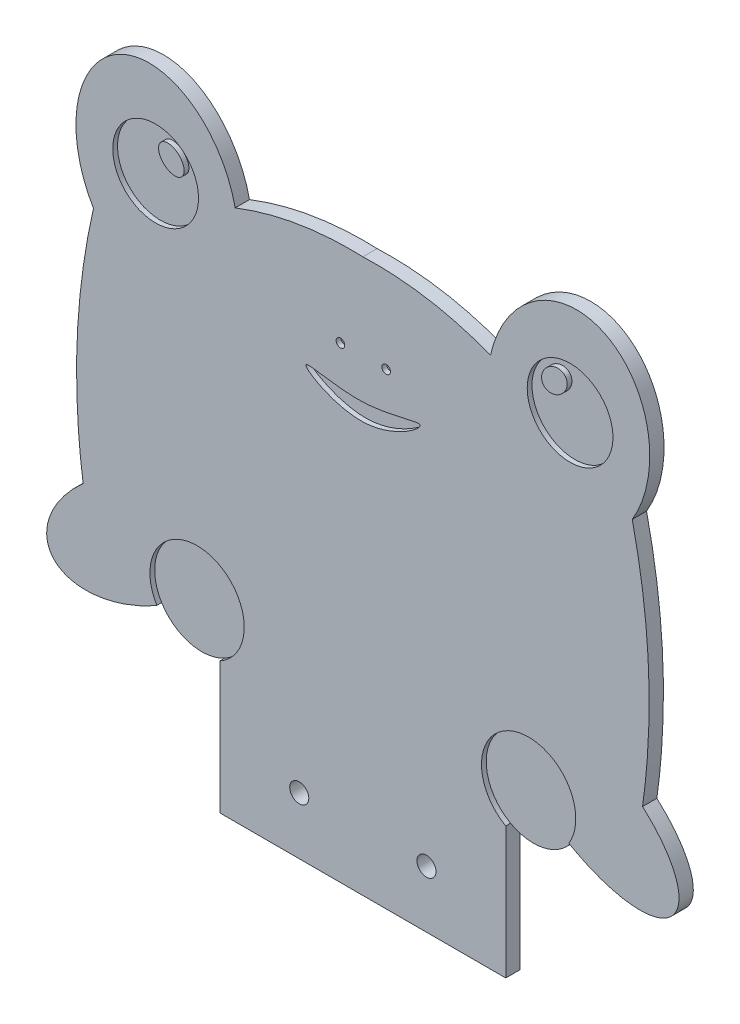
ISO-10303-21;
HEADER;
FILE_DESCRIPTION(('STEP AP214'),'2;1');
FILE_NAME('part.step','',(''),(''),'','','');
FILE_SCHEMA(('AUTOMOTIVE_DESIGN { 1 0 10303 214 1 1 1 1 }'));
ENDSEC;
DATA;
#1=APPLICATION_CONTEXT('core data for automotive mechanical design processes');
#2=APPLICATION_PROTOCOL_DEFINITION('international standard','automotive_design',2000,#1);
#3=PRODUCT_CONTEXT('',#1,'mechanical');
#4=PRODUCT('Part','Part','',(#3));
#5=PRODUCT_RELATED_PRODUCT_CATEGORY('part','',(#4));
#6=PRODUCT_DEFINITION_FORMATION('','',#4);
#7=PRODUCT_DEFINITION_CONTEXT('part definition',#1,'design');
#8=PRODUCT_DEFINITION('design','',#6,#7);
#9=PRODUCT_DEFINITION_SHAPE('','',#8);
#10=(LENGTH_UNIT() NAMED_UNIT(*) SI_UNIT(.MILLI.,.METRE.));
#11=(NAMED_UNIT(*) PLANE_ANGLE_UNIT() SI_UNIT($,.RADIAN.));
#12=(NAMED_UNIT(*) SI_UNIT($,.STERADIAN.) SOLID_ANGLE_UNIT());
#13=UNCERTAINTY_MEASURE_WITH_UNIT(LENGTH_MEASURE(1.E-05),#10,'distance_accuracy_value','');
#14=(GEOMETRIC_REPRESENTATION_CONTEXT(3) GLOBAL_UNCERTAINTY_ASSIGNED_CONTEXT((#13)) GLOBAL_UNIT_ASSIGNED_CONTEXT((#10,
#11,#12)) REPRESENTATION_CONTEXT('',''));
#15=CARTESIAN_POINT('',(0.,0.,0.));
#16=DIRECTION('',(0.,0.,1.));
#17=DIRECTION('',(1.,0.,0.));
#18=AXIS2_PLACEMENT_3D('',#15,#16,#17);
#19=CARTESIAN_POINT('',(-34.8,-34.2,3.));
#20=DIRECTION('',(0.,0.,-1.));
#21=DIRECTION('',(-1.,0.,0.));
#22=AXIS2_PLACEMENT_3D('',#19,#20,#21);
#23=CYLINDRICAL_SURFACE('',#22,9.9);
#24=CARTESIAN_POINT('',(-34.8,-34.2,2.));
#25=DIRECTION('',(0.,0.,1.));
#26=DIRECTION('',(1.,0.,0.));
#27=AXIS2_PLACEMENT_3D('',#24,#25,#26);
#28=CIRCLE('',#27,9.9);
#29=CARTESIAN_POINT('',(-43.2356609466188,-39.3816623195351,2.));
#30=VERTEX_POINT('',#29);
#31=CARTESIAN_POINT('',(-30.,-42.8585218137971,2.));
#32=VERTEX_POINT('',#31);
#33=EDGE_CURVE('E675',#30,#32,#28,.T.);
#34=ORIENTED_EDGE('',*,*,#33,.F.);
#35=DIRECTION('',(0.,0.,-1.));
#36=VECTOR('',#35,1.);
#37=CARTESIAN_POINT('',(-43.2356609466188,-39.3816623195351,3.));
#38=LINE('',#37,#36);
#39=CARTESIAN_POINT('',(-43.2356609466188,-39.3816623195351,0.));
#40=VERTEX_POINT('',#39);
#41=EDGE_CURVE('E621',#30,#40,#38,.T.);
#42=ORIENTED_EDGE('',*,*,#41,.T.);
#43=CARTESIAN_POINT('',(-34.8,-34.2,0.));
#44=DIRECTION('',(0.,0.,1.));
#45=DIRECTION('',(1.,0.,0.));
#46=AXIS2_PLACEMENT_3D('',#43,#44,#45);
#47=CIRCLE('',#46,9.9);
#48=CARTESIAN_POINT('',(-30.,-42.8585218137971,0.));
#49=VERTEX_POINT('',#48);
#50=EDGE_CURVE('E632',#40,#49,#47,.T.);
#51=ORIENTED_EDGE('',*,*,#50,.T.);
#52=DIRECTION('',(0.,0.,-1.));
#53=VECTOR('',#52,1.);
#54=CARTESIAN_POINT('',(-30.,-42.8585218137971,3.));
#55=LINE('',#54,#53);
#56=EDGE_CURVE('E635',#32,#49,#55,.T.);
#57=ORIENTED_EDGE('',*,*,#56,.F.);
#58=EDGE_LOOP('',(#34,#42,#51,#57));
#59=FACE_BOUND('',#58,.T.);
#60=ADVANCED_FACE('F416',(#59),#23,.T.);
#61=CARTESIAN_POINT('',(0.,0.,3.));
#62=DIRECTION('',(0.,0.,1.));
#63=DIRECTION('',(1.,0.,0.));
#64=AXIS2_PLACEMENT_3D('',#61,#62,#63);
#65=PLANE('',#64);
#66=CARTESIAN_POINT('',(-13.35,-58.5,3.));
#67=DIRECTION('',(0.,0.,1.));
#68=DIRECTION('',(1.,0.,0.));
#69=AXIS2_PLACEMENT_3D('',#66,#67,#68);
#70=CIRCLE('',#69,2.);
#71=CARTESIAN_POINT('',(-11.35,-58.5,3.));
#72=VERTEX_POINT('',#71);
#73=EDGE_CURVE('E861',#72,#72,#70,.T.);
#74=ORIENTED_EDGE('',*,*,#73,.F.);
#75=EDGE_LOOP('',(#74));
#76=FACE_BOUND('',#75,.T.);
#77=CARTESIAN_POINT('',(13.35,-58.5,3.));
#78=DIRECTION('',(0.,0.,1.));
#79=DIRECTION('',(1.,0.,0.));
#80=AXIS2_PLACEMENT_3D('',#77,#78,#79);
#81=CIRCLE('',#80,2.);
#82=CARTESIAN_POINT('',(15.35,-58.5,3.));
#83=VERTEX_POINT('',#82);
#84=EDGE_CURVE('E856',#83,#83,#81,.T.);
#85=ORIENTED_EDGE('',*,*,#84,.F.);
#86=EDGE_LOOP('',(#85));
#87=FACE_BOUND('',#86,.T.);
#88=CARTESIAN_POINT('',(-34.8,-34.2,3.));
#89=DIRECTION('',(0.,0.,1.));
#90=DIRECTION('',(1.,0.,0.));
#91=AXIS2_PLACEMENT_3D('',#88,#89,#90);
#92=CIRCLE('',#91,9.9);
#93=CARTESIAN_POINT('',(-30.,-42.8585218137971,3.));
#94=VERTEX_POINT('',#93);
#95=CARTESIAN_POINT('',(-43.2356609466188,-39.3816623195351,3.));
#96=VERTEX_POINT('',#95);
#97=EDGE_CURVE('E849',#94,#96,#92,.T.);
#98=ORIENTED_EDGE('',*,*,#97,.F.);
#99=DIRECTION('',(0.,-1.,0.));
#100=VECTOR('',#99,1.);
#101=CARTESIAN_POINT('',(-30.,-10.5,3.));
#102=LINE('',#101,#100);
#103=CARTESIAN_POINT('',(-30.,-70.5,3.));
#104=VERTEX_POINT('',#103);
#105=EDGE_CURVE('E647',#94,#104,#102,.T.);
#106=ORIENTED_EDGE('',*,*,#105,.T.);
#107=DIRECTION('',(1.,0.,0.));
#108=VECTOR('',#107,1.);
#109=CARTESIAN_POINT('',(-30.,-70.5,3.));
#110=LINE('',#109,#108);
#111=CARTESIAN_POINT('',(30.,-70.5,3.));
#112=VERTEX_POINT('',#111);
#113=EDGE_CURVE('E641',#104,#112,#110,.T.);
#114=ORIENTED_EDGE('',*,*,#113,.T.);
#115=DIRECTION('',(0.,-1.,0.));
#116=VECTOR('',#115,1.);
#117=CARTESIAN_POINT('',(30.,-10.5,3.));
#118=LINE('',#117,#116);
#119=CARTESIAN_POINT('',(30.,-42.8585218137971,3.));
#120=VERTEX_POINT('',#119);
#121=EDGE_CURVE('E644',#120,#112,#118,.T.);
#122=ORIENTED_EDGE('',*,*,#121,.F.);
#123=CARTESIAN_POINT('',(34.8,-34.2,3.));
#124=DIRECTION('',(0.,0.,1.));
#125=DIRECTION('',(-1.,0.,0.));
#126=AXIS2_PLACEMENT_3D('',#123,#124,#125);
#127=CIRCLE('',#126,9.9);
#128=CARTESIAN_POINT('',(43.2356609466188,-39.3816623195351,3.));
#129=VERTEX_POINT('',#128);
#130=EDGE_CURVE('E685',#129,#120,#127,.T.);
#131=ORIENTED_EDGE('',*,*,#130,.F.);
#132=CARTESIAN_POINT('',(47.712,-29.82,3.));
#133=DIRECTION('',(0.,0.,-1.));
#134=DIRECTION('',(0.847998304005088,-0.52999894000318,0.));
#135=AXIS2_PLACEMENT_3D('',#132,#133,#134);
#136=ELLIPSE('',#135,21.,10.5);
#137=CARTESIAN_POINT('',(58.715402700733,-24.9746712271509,3.));
#138=VERTEX_POINT('',#137);
#139=EDGE_CURVE('E626',#138,#129,#136,.T.);
#140=ORIENTED_EDGE('',*,*,#139,.F.);
#141=CARTESIAN_POINT('',(56.5490471536024,26.1535692010801,3.));
#142=CARTESIAN_POINT('',(63.7245288982319,-5.54456864556982,3.));
#143=CARTESIAN_POINT('',(56.4,-37.5,3.));
#144=B_SPLINE_CURVE_WITH_KNOTS('',2,(#141,#142,#143),.UNSPECIFIED.,.F.,.F.,(3,3),(0.,1.),.UNSPECIFIED.);
#145=CARTESIAN_POINT('',(56.5490471536024,26.1535692010801,3.));
#146=VERTEX_POINT('',#145);
#147=EDGE_CURVE('E596',#146,#138,#144,.T.);
#148=ORIENTED_EDGE('',*,*,#147,.F.);
#149=CARTESIAN_POINT('',(43.2,37.5,3.));
#150=DIRECTION('',(0.,0.,-1.));
#151=DIRECTION('',(0.214939209404732,0.976627429606843,0.));
#152=AXIS2_PLACEMENT_3D('',#149,#150,#151);
#153=ELLIPSE('',#152,21.1032368897287,16.8);
#154=CARTESIAN_POINT('',(26.792659182605,41.1109787179995,3.));
#155=VERTEX_POINT('',#154);
#156=EDGE_CURVE('E589',#155,#146,#153,.T.);
#157=ORIENTED_EDGE('',*,*,#156,.F.);
#158=CARTESIAN_POINT('',(26.792659182605,41.1109787179995,3.));
#159=CARTESIAN_POINT('',(13.8894718421748,46.1319547629389,3.));
#160=CARTESIAN_POINT('',(0.,45.6,3.));
#161=B_SPLINE_CURVE_WITH_KNOTS('',2,(#158,#159,#160),.UNSPECIFIED.,.F.,.F.,(3,3),(0.,1.),.UNSPECIFIED.);
#162=CARTESIAN_POINT('',(0.,45.6,3.));
#163=VERTEX_POINT('',#162);
#164=EDGE_CURVE('E581',#155,#163,#161,.T.);
#165=ORIENTED_EDGE('',*,*,#164,.T.);
#166=CARTESIAN_POINT('',(-26.792659182605,41.1109787179995,3.));
#167=CARTESIAN_POINT('',(-13.8894718421748,46.1319547629389,3.));
#168=CARTESIAN_POINT('',(0.,45.6,3.));
#169=B_SPLINE_CURVE_WITH_KNOTS('',2,(#166,#167,#168),.UNSPECIFIED.,.F.,.F.,(3,3),(0.,1.),.UNSPECIFIED.);
#170=CARTESIAN_POINT('',(-26.792659182605,41.1109787179995,3.));
#171=VERTEX_POINT('',#170);
#172=EDGE_CURVE('E531',#171,#163,#169,.T.);
#173=ORIENTED_EDGE('',*,*,#172,.F.);
#174=CARTESIAN_POINT('',(-43.2,37.5,3.));
#175=DIRECTION('',(0.,0.,1.));
#176=DIRECTION('',(-0.214939209404733,0.976627429606843,0.));
#177=AXIS2_PLACEMENT_3D('',#174,#175,#176);
#178=ELLIPSE('',#177,21.1032368897287,16.8);
#179=CARTESIAN_POINT('',(-56.5490471536024,26.1535692010801,3.));
#180=VERTEX_POINT('',#179);
#181=EDGE_CURVE('E522',#171,#180,#178,.T.);
#182=ORIENTED_EDGE('',*,*,#181,.T.);
#183=CARTESIAN_POINT('',(-56.5490471536024,26.1535692010801,3.));
#184=CARTESIAN_POINT('',(-63.7245288982319,-5.54456864556982,3.));
#185=CARTESIAN_POINT('',(-56.4,-37.5,3.));
#186=B_SPLINE_CURVE_WITH_KNOTS('',2,(#183,#184,#185),.UNSPECIFIED.,.F.,.F.,(3,3),(0.,1.),.UNSPECIFIED.);
#187=CARTESIAN_POINT('',(-58.715402700733,-24.9746712271509,3.));
#188=VERTEX_POINT('',#187);
#189=EDGE_CURVE('E529',#180,#188,#186,.T.);
#190=ORIENTED_EDGE('',*,*,#189,.T.);
#191=CARTESIAN_POINT('',(-47.712,-29.82,3.));
#192=DIRECTION('',(0.,0.,1.));
#193=DIRECTION('',(-0.847998304005088,-0.52999894000318,0.));
#194=AXIS2_PLACEMENT_3D('',#191,#192,#193);
#195=ELLIPSE('',#194,21.,10.5);
#196=EDGE_CURVE('E618',#188,#96,#195,.T.);
#197=ORIENTED_EDGE('',*,*,#196,.T.);
#198=EDGE_LOOP('',(#98,#106,#114,#122,#131,#140,#148,#157,#165,#173,#182,#190,#197));
#199=FACE_BOUND('',#198,.T.);
#200=CARTESIAN_POINT('',(-11.9791691585053,20.,3.));
#201=CARTESIAN_POINT('',(-12.2218538112106,19.1634506144739,3.));
#202=CARTESIAN_POINT('',(0.336817720777928,11.5253867947841,3.));
#203=CARTESIAN_POINT('',(17.9163741988928,24.2247446951573,3.));
#204=CARTESIAN_POINT('',(0.167482990841705,17.1340066363648,3.));
#205=CARTESIAN_POINT('',(-11.7502543081893,20.789084003603,3.));
#206=CARTESIAN_POINT('',(-11.9791691585053,20.,3.));
#207=B_SPLINE_CURVE_WITH_KNOTS('',3,(#200,#201,#202,#203,#204,#205,#206),.UNSPECIFIED.,.T.,.F.,
(4,1,1,1,4),(0.,0.256649661559157,0.517799284457874,0.757912508250658,1.),.UNSPECIFIED.);
#208=CARTESIAN_POINT('',(-11.9791691585053,20.,3.));
#209=VERTEX_POINT('',#208);
#210=EDGE_CURVE('E694',#209,#209,#207,.T.);
#211=ORIENTED_EDGE('',*,*,#210,.F.);
#212=EDGE_LOOP('',(#211));
#213=FACE_BOUND('',#212,.T.);
#214=CARTESIAN_POINT('',(4.89293127120258,27.5997231955837,3.));
#215=DIRECTION('',(0.,0.,1.));
#216=DIRECTION('',(1.,0.,0.));
#217=AXIS2_PLACEMENT_3D('',#214,#215,#216);
#218=CIRCLE('',#217,0.899999999999996);
#219=CARTESIAN_POINT('',(5.79293127120257,27.5997231955837,3.));
#220=VERTEX_POINT('',#219);
#221=EDGE_CURVE('E1088',#220,#220,#218,.T.);
#222=ORIENTED_EDGE('',*,*,#221,.F.);
#223=EDGE_LOOP('',(#222));
#224=FACE_BOUND('',#223,.T.);
#225=CARTESIAN_POINT('',(-4.70706872879742,27.5997231955837,3.));
#226=DIRECTION('',(0.,0.,1.));
#227=DIRECTION('',(1.,0.,0.));
#228=AXIS2_PLACEMENT_3D('',#225,#226,#227);
#229=CIRCLE('',#228,0.899999999999995);
#230=CARTESIAN_POINT('',(-3.80706872879743,27.5997231955837,3.));
#231=VERTEX_POINT('',#230);
#232=EDGE_CURVE('E674',#231,#231,#229,.T.);
#233=ORIENTED_EDGE('',*,*,#232,.F.);
#234=EDGE_LOOP('',(#233));
#235=FACE_BOUND('',#234,.T.);
#236=CARTESIAN_POINT('',(43.5,39.,3.));
#237=DIRECTION('',(0.,0.,-1.));
#238=DIRECTION('',(-1.,0.,0.));
#239=AXIS2_PLACEMENT_3D('',#236,#237,#238);
#240=CIRCLE('',#239,9.);
#241=CARTESIAN_POINT('',(34.5,39.,3.));
#242=VERTEX_POINT('',#241);
#243=EDGE_CURVE('E748',#242,#242,#240,.T.);
#244=ORIENTED_EDGE('',*,*,#243,.T.);
#245=EDGE_LOOP('',(#244));
#246=FACE_BOUND('',#245,.T.);
#247=CARTESIAN_POINT('',(-43.5,39.,3.));
#248=DIRECTION('',(0.,0.,1.));
#249=DIRECTION('',(1.,0.,0.));
#250=AXIS2_PLACEMENT_3D('',#247,#248,#249);
#251=CIRCLE('',#250,9.);
#252=CARTESIAN_POINT('',(-34.5,39.,3.));
#253=VERTEX_POINT('',#252);
#254=EDGE_CURVE('E738',#253,#253,#251,.T.);
#255=ORIENTED_EDGE('',*,*,#254,.F.);
#256=EDGE_LOOP('',(#255));
#257=FACE_BOUND('',#256,.T.);
#258=ADVANCED_FACE('F525',(#76,#87,#199,#213,#224,#235,#246,#257),#65,.T.);
#259=DIRECTION('',(0.,0.,-1.));
#260=VECTOR('',#259,1.);
#261=SURFACE_OF_LINEAR_EXTRUSION('',#153,#260);
#262=CARTESIAN_POINT('',(43.2,37.5,0.));
#263=DIRECTION('',(0.,0.,-1.));
#264=DIRECTION('',(0.214939209404732,0.976627429606843,0.));
#265=AXIS2_PLACEMENT_3D('',#262,#263,#264);
#266=ELLIPSE('',#265,21.1032368897287,16.8);
#267=CARTESIAN_POINT('',(26.792659182605,41.1109787179995,0.));
#268=VERTEX_POINT('',#267);
#269=CARTESIAN_POINT('',(56.5490471536024,26.1535692010801,0.));
#270=VERTEX_POINT('',#269);
#271=EDGE_CURVE('E830',#268,#270,#266,.T.);
#272=ORIENTED_EDGE('',*,*,#271,.F.);
#273=DIRECTION('',(0.,0.,-1.));
#274=VECTOR('',#273,1.);
#275=CARTESIAN_POINT('',(26.792659182605,41.1109787179995,3.));
#276=LINE('',#275,#274);
#277=EDGE_CURVE('E426',#155,#268,#276,.T.);
#278=ORIENTED_EDGE('',*,*,#277,.F.);
#279=ORIENTED_EDGE('',*,*,#156,.T.);
#280=DIRECTION('',(0.,0.,-1.));
#281=VECTOR('',#280,1.);
#282=CARTESIAN_POINT('',(56.5490471536024,26.1535692010801,3.));
#283=LINE('',#282,#281);
#284=EDGE_CURVE('E12',#146,#270,#283,.T.);
#285=ORIENTED_EDGE('',*,*,#284,.T.);
#286=EDGE_LOOP('',(#272,#278,#279,#285));
#287=FACE_BOUND('',#286,.T.);
#288=ADVANCED_FACE('F601',(#287),#261,.T.);
#289=DIRECTION('',(0.,0.,-1.));
#290=VECTOR('',#289,1.);
#291=SURFACE_OF_LINEAR_EXTRUSION('',#161,#290);
#292=CARTESIAN_POINT('',(26.792659182605,41.1109787179995,0.));
#293=CARTESIAN_POINT('',(13.8894718421748,46.1319547629389,0.));
#294=CARTESIAN_POINT('',(0.,45.6,0.));
#295=B_SPLINE_CURVE_WITH_KNOTS('',2,(#292,#293,#294),.UNSPECIFIED.,.F.,.F.,(3,3),(0.,1.),.UNSPECIFIED.);
#296=CARTESIAN_POINT('',(0.,45.6,0.));
#297=VERTEX_POINT('',#296);
#298=EDGE_CURVE('E825',#268,#297,#295,.T.);
#299=ORIENTED_EDGE('',*,*,#298,.T.);
#300=DIRECTION('',(0.,0.,-1.));
#301=VECTOR('',#300,1.);
#302=CARTESIAN_POINT('',(0.,45.6,3.));
#303=LINE('',#302,#301);
#304=EDGE_CURVE('E819',#163,#297,#303,.T.);
#305=ORIENTED_EDGE('',*,*,#304,.F.);
#306=ORIENTED_EDGE('',*,*,#164,.F.);
#307=ORIENTED_EDGE('',*,*,#277,.T.);
#308=EDGE_LOOP('',(#299,#305,#306,#307));
#309=FACE_BOUND('',#308,.T.);
#310=ADVANCED_FACE('F574',(#309),#291,.F.);
#311=DIRECTION('',(0.,0.,-1.));
#312=VECTOR('',#311,1.);
#313=SURFACE_OF_LINEAR_EXTRUSION('',#169,#312);
#314=CARTESIAN_POINT('',(-26.792659182605,41.1109787179995,0.));
#315=CARTESIAN_POINT('',(-13.8894718421748,46.1319547629389,0.));
#316=CARTESIAN_POINT('',(0.,45.6,0.));
#317=B_SPLINE_CURVE_WITH_KNOTS('',2,(#314,#315,#316),.UNSPECIFIED.,.F.,.F.,(3,3),(0.,1.),.UNSPECIFIED.);
#318=CARTESIAN_POINT('',(-26.792659182605,41.1109787179995,0.));
#319=VERTEX_POINT('',#318);
#320=EDGE_CURVE('E808',#319,#297,#317,.T.);
#321=ORIENTED_EDGE('',*,*,#320,.F.);
#322=DIRECTION('',(0.,0.,-1.));
#323=VECTOR('',#322,1.);
#324=CARTESIAN_POINT('',(-26.792659182605,41.1109787179995,3.));
#325=LINE('',#324,#323);
#326=EDGE_CURVE('E542',#171,#319,#325,.T.);
#327=ORIENTED_EDGE('',*,*,#326,.F.);
#328=ORIENTED_EDGE('',*,*,#172,.T.);
#329=ORIENTED_EDGE('',*,*,#304,.T.);
#330=EDGE_LOOP('',(#321,#327,#328,#329));
#331=FACE_BOUND('',#330,.T.);
#332=ADVANCED_FACE('F571',(#331),#313,.T.);
#333=DIRECTION('',(0.,0.,-1.));
#334=VECTOR('',#333,1.);
#335=SURFACE_OF_LINEAR_EXTRUSION('',#178,#334);
#336=CARTESIAN_POINT('',(-43.2,37.5,0.));
#337=DIRECTION('',(0.,0.,1.));
#338=DIRECTION('',(-0.214939209404733,0.976627429606843,0.));
#339=AXIS2_PLACEMENT_3D('',#336,#337,#338);
#340=ELLIPSE('',#339,21.1032368897287,16.8);
#341=CARTESIAN_POINT('',(-56.5490471536024,26.1535692010801,0.));
#342=VERTEX_POINT('',#341);
#343=EDGE_CURVE('E538',#319,#342,#340,.T.);
#344=ORIENTED_EDGE('',*,*,#343,.T.);
#345=DIRECTION('',(0.,0.,-1.));
#346=VECTOR('',#345,1.);
#347=CARTESIAN_POINT('',(-56.5490471536024,26.1535692010801,3.));
#348=LINE('',#347,#346);
#349=EDGE_CURVE('E535',#180,#342,#348,.T.);
#350=ORIENTED_EDGE('',*,*,#349,.F.);
#351=ORIENTED_EDGE('',*,*,#181,.F.);
#352=ORIENTED_EDGE('',*,*,#326,.T.);
#353=EDGE_LOOP('',(#344,#350,#351,#352));
#354=FACE_BOUND('',#353,.T.);
#355=ADVANCED_FACE('F536',(#354),#335,.F.);
#356=DIRECTION('',(0.,0.,-1.));
#357=VECTOR('',#356,1.);
#358=SURFACE_OF_LINEAR_EXTRUSION('',#186,#357);
#359=CARTESIAN_POINT('',(-56.5490471536024,26.1535692010801,0.));
#360=CARTESIAN_POINT('',(-63.7245288982319,-5.54456864556982,0.));
#361=CARTESIAN_POINT('',(-56.4,-37.5,0.));
#362=B_SPLINE_CURVE_WITH_KNOTS('',2,(#359,#360,#361),.UNSPECIFIED.,.F.,.F.,(3,3),(0.,1.),.UNSPECIFIED.);
#363=CARTESIAN_POINT('',(-58.715402700733,-24.9746712271509,0.));
#364=VERTEX_POINT('',#363);
#365=EDGE_CURVE('E805',#342,#364,#362,.T.);
#366=ORIENTED_EDGE('',*,*,#365,.T.);
#367=DIRECTION('',(0.,0.,-1.));
#368=VECTOR('',#367,1.);
#369=CARTESIAN_POINT('',(-58.715402700733,-24.9746712271509,3.));
#370=LINE('',#369,#368);
#371=EDGE_CURVE('E543',#188,#364,#370,.T.);
#372=ORIENTED_EDGE('',*,*,#371,.F.);
#373=ORIENTED_EDGE('',*,*,#189,.F.);
#374=ORIENTED_EDGE('',*,*,#349,.T.);
#375=EDGE_LOOP('',(#366,#372,#373,#374));
#376=FACE_BOUND('',#375,.T.);
#377=ADVANCED_FACE('F545',(#376),#358,.F.);
#378=DIRECTION('',(0.,0.,-1.));
#379=VECTOR('',#378,1.);
#380=SURFACE_OF_LINEAR_EXTRUSION('',#144,#379);
#381=CARTESIAN_POINT('',(56.5490471536024,26.1535692010801,0.));
#382=CARTESIAN_POINT('',(63.7245288982319,-5.54456864556982,0.));
#383=CARTESIAN_POINT('',(56.4,-37.5,0.));
#384=B_SPLINE_CURVE_WITH_KNOTS('',2,(#381,#382,#383),.UNSPECIFIED.,.F.,.F.,(3,3),(0.,1.),.UNSPECIFIED.);
#385=CARTESIAN_POINT('',(58.715402700733,-24.9746712271509,0.));
#386=VERTEX_POINT('',#385);
#387=EDGE_CURVE('E555',#270,#386,#384,.T.);
#388=ORIENTED_EDGE('',*,*,#387,.F.);
#389=ORIENTED_EDGE('',*,*,#284,.F.);
#390=ORIENTED_EDGE('',*,*,#147,.T.);
#391=DIRECTION('',(0.,0.,-1.));
#392=VECTOR('',#391,1.);
#393=CARTESIAN_POINT('',(58.715402700733,-24.9746712271509,3.));
#394=LINE('',#393,#392);
#395=EDGE_CURVE('E435',#138,#386,#394,.T.);
#396=ORIENTED_EDGE('',*,*,#395,.T.);
#397=EDGE_LOOP('',(#388,#389,#390,#396));
#398=FACE_BOUND('',#397,.T.);
#399=ADVANCED_FACE('F566',(#398),#380,.T.);
#400=CARTESIAN_POINT('',(0.,0.,0.));
#401=DIRECTION('',(0.,0.,1.));
#402=DIRECTION('',(1.,0.,0.));
#403=AXIS2_PLACEMENT_3D('',#400,#401,#402);
#404=PLANE('',#403);
#405=CARTESIAN_POINT('',(-13.35,-58.5,0.));
#406=DIRECTION('',(0.,0.,1.));
#407=DIRECTION('',(1.,0.,0.));
#408=AXIS2_PLACEMENT_3D('',#405,#406,#407);
#409=CIRCLE('',#408,2.);
#410=CARTESIAN_POINT('',(-11.35,-58.5,0.));
#411=VERTEX_POINT('',#410);
#412=EDGE_CURVE('E859',#411,#411,#409,.T.);
#413=ORIENTED_EDGE('',*,*,#412,.T.);
#414=EDGE_LOOP('',(#413));
#415=FACE_BOUND('',#414,.T.);
#416=CARTESIAN_POINT('',(13.35,-58.5,0.));
#417=DIRECTION('',(0.,0.,1.));
#418=DIRECTION('',(1.,0.,0.));
#419=AXIS2_PLACEMENT_3D('',#416,#417,#418);
#420=CIRCLE('',#419,2.);
#421=CARTESIAN_POINT('',(15.35,-58.5,0.));
#422=VERTEX_POINT('',#421);
#423=EDGE_CURVE('E866',#422,#422,#420,.T.);
#424=ORIENTED_EDGE('',*,*,#423,.T.);
#425=EDGE_LOOP('',(#424));
#426=FACE_BOUND('',#425,.T.);
#427=CARTESIAN_POINT('',(34.8,-34.2,0.));
#428=DIRECTION('',(0.,0.,-1.));
#429=DIRECTION('',(-1.,0.,0.));
#430=AXIS2_PLACEMENT_3D('',#427,#428,#429);
#431=CIRCLE('',#430,9.9);
#432=CARTESIAN_POINT('',(43.2356609466188,-39.3816623195351,0.));
#433=VERTEX_POINT('',#432);
#434=CARTESIAN_POINT('',(30.,-42.8585218137971,0.));
#435=VERTEX_POINT('',#434);
#436=EDGE_CURVE('E637',#433,#435,#431,.T.);
#437=ORIENTED_EDGE('',*,*,#436,.T.);
#438=DIRECTION('',(0.,-1.,0.));
#439=VECTOR('',#438,1.);
#440=CARTESIAN_POINT('',(30.,-10.5,0.));
#441=LINE('',#440,#439);
#442=CARTESIAN_POINT('',(30.,-70.5,0.));
#443=VERTEX_POINT('',#442);
#444=EDGE_CURVE('E491',#435,#443,#441,.T.);
#445=ORIENTED_EDGE('',*,*,#444,.T.);
#446=DIRECTION('',(1.,0.,0.));
#447=VECTOR('',#446,1.);
#448=CARTESIAN_POINT('',(-30.,-70.5,0.));
#449=LINE('',#448,#447);
#450=CARTESIAN_POINT('',(-30.,-70.5,0.));
#451=VERTEX_POINT('',#450);
#452=EDGE_CURVE('E650',#451,#443,#449,.T.);
#453=ORIENTED_EDGE('',*,*,#452,.F.);
#454=DIRECTION('',(0.,-1.,0.));
#455=VECTOR('',#454,1.);
#456=CARTESIAN_POINT('',(-30.,-10.5,0.));
#457=LINE('',#456,#455);
#458=EDGE_CURVE('E645',#49,#451,#457,.T.);
#459=ORIENTED_EDGE('',*,*,#458,.F.);
#460=ORIENTED_EDGE('',*,*,#50,.F.);
#461=CARTESIAN_POINT('',(-47.712,-29.82,0.));
#462=DIRECTION('',(0.,0.,1.));
#463=DIRECTION('',(-0.847998304005088,-0.52999894000318,0.));
#464=AXIS2_PLACEMENT_3D('',#461,#462,#463);
#465=ELLIPSE('',#464,21.,10.5);
#466=EDGE_CURVE('E622',#364,#40,#465,.T.);
#467=ORIENTED_EDGE('',*,*,#466,.F.);
#468=ORIENTED_EDGE('',*,*,#365,.F.);
#469=ORIENTED_EDGE('',*,*,#343,.F.);
#470=ORIENTED_EDGE('',*,*,#320,.T.);
#471=ORIENTED_EDGE('',*,*,#298,.F.);
#472=ORIENTED_EDGE('',*,*,#271,.T.);
#473=ORIENTED_EDGE('',*,*,#387,.T.);
#474=CARTESIAN_POINT('',(47.712,-29.82,0.));
#475=DIRECTION('',(0.,0.,-1.));
#476=DIRECTION('',(0.847998304005088,-0.52999894000318,0.));
#477=AXIS2_PLACEMENT_3D('',#474,#475,#476);
#478=ELLIPSE('',#477,21.,10.5);
#479=EDGE_CURVE('E629',#386,#433,#478,.T.);
#480=ORIENTED_EDGE('',*,*,#479,.T.);
#481=EDGE_LOOP('',(#437,#445,#453,#459,#460,#467,#468,#469,#470,#471,#472,#473,#480));
#482=FACE_BOUND('',#481,.T.);
#483=ADVANCED_FACE('F567',(#415,#426,#482),#404,.F.);
#484=CARTESIAN_POINT('',(34.8,-34.2,3.));
#485=DIRECTION('',(0.,0.,-1.));
#486=DIRECTION('',(-1.,0.,0.));
#487=AXIS2_PLACEMENT_3D('',#484,#485,#486);
#488=CYLINDRICAL_SURFACE('',#487,9.9);
#489=CARTESIAN_POINT('',(34.8,-34.2,2.));
#490=DIRECTION('',(0.,0.,1.));
#491=DIRECTION('',(-1.,0.,0.));
#492=AXIS2_PLACEMENT_3D('',#489,#490,#491);
#493=CIRCLE('',#492,9.9);
#494=CARTESIAN_POINT('',(30.,-42.8585218137971,2.));
#495=VERTEX_POINT('',#494);
#496=CARTESIAN_POINT('',(43.2356609466188,-39.3816623195351,2.));
#497=VERTEX_POINT('',#496);
#498=EDGE_CURVE('E669',#495,#497,#493,.T.);
#499=ORIENTED_EDGE('',*,*,#498,.F.);
#500=DIRECTION('',(0.,0.,-1.));
#501=VECTOR('',#500,1.);
#502=CARTESIAN_POINT('',(30.,-42.8585218137971,3.));
#503=LINE('',#502,#501);
#504=EDGE_CURVE('E636',#435,#495,#503,.F.);
#505=ORIENTED_EDGE('',*,*,#504,.F.);
#506=ORIENTED_EDGE('',*,*,#436,.F.);
#507=DIRECTION('',(0.,0.,-1.));
#508=VECTOR('',#507,1.);
#509=CARTESIAN_POINT('',(43.2356609466188,-39.3816623195351,3.));
#510=LINE('',#509,#508);
#511=EDGE_CURVE('E625',#433,#497,#510,.F.);
#512=ORIENTED_EDGE('',*,*,#511,.T.);
#513=EDGE_LOOP('',(#499,#505,#506,#512));
#514=FACE_BOUND('',#513,.T.);
#515=ADVANCED_FACE('F667',(#514),#488,.T.);
#516=DIRECTION('',(0.,0.,-1.));
#517=VECTOR('',#516,1.);
#518=SURFACE_OF_LINEAR_EXTRUSION('',#136,#517);
#519=ORIENTED_EDGE('',*,*,#479,.F.);
#520=ORIENTED_EDGE('',*,*,#395,.F.);
#521=ORIENTED_EDGE('',*,*,#139,.T.);
#522=DIRECTION('',(0.,0.,-1.));
#523=VECTOR('',#522,1.);
#524=CARTESIAN_POINT('',(43.2356609466188,-39.3816623195351,3.));
#525=LINE('',#524,#523);
#526=EDGE_CURVE('E672',#497,#129,#525,.F.);
#527=ORIENTED_EDGE('',*,*,#526,.F.);
#528=ORIENTED_EDGE('',*,*,#511,.F.);
#529=EDGE_LOOP('',(#519,#520,#521,#527,#528));
#530=FACE_BOUND('',#529,.T.);
#531=ADVANCED_FACE('F615',(#530),#518,.T.);
#532=CARTESIAN_POINT('',(-30.,-10.5,3.));
#533=DIRECTION('',(1.,0.,0.));
#534=DIRECTION('',(0.,1.,0.));
#535=AXIS2_PLACEMENT_3D('',#532,#533,#534);
#536=PLANE('',#535);
#537=ORIENTED_EDGE('',*,*,#105,.F.);
#538=EDGE_CURVE('E631',#94,#32,#55,.T.);
#539=ORIENTED_EDGE('',*,*,#538,.T.);
#540=ORIENTED_EDGE('',*,*,#56,.T.);
#541=ORIENTED_EDGE('',*,*,#458,.T.);
#542=DIRECTION('',(0.,0.,-1.));
#543=VECTOR('',#542,1.);
#544=CARTESIAN_POINT('',(-30.,-70.5,3.));
#545=LINE('',#544,#543);
#546=EDGE_CURVE('E649',#104,#451,#545,.T.);
#547=ORIENTED_EDGE('',*,*,#546,.F.);
#548=EDGE_LOOP('',(#537,#539,#540,#541,#547));
#549=FACE_BOUND('',#548,.T.);
#550=ADVANCED_FACE('F781',(#549),#536,.F.);
#551=CARTESIAN_POINT('',(-30.,-70.5,3.));
#552=DIRECTION('',(0.,1.,0.));
#553=DIRECTION('',(0.,0.,1.));
#554=AXIS2_PLACEMENT_3D('',#551,#552,#553);
#555=PLANE('',#554);
#556=ORIENTED_EDGE('',*,*,#452,.T.);
#557=DIRECTION('',(0.,0.,-1.));
#558=VECTOR('',#557,1.);
#559=CARTESIAN_POINT('',(30.,-70.5,3.));
#560=LINE('',#559,#558);
#561=EDGE_CURVE('E640',#112,#443,#560,.T.);
#562=ORIENTED_EDGE('',*,*,#561,.F.);
#563=ORIENTED_EDGE('',*,*,#113,.F.);
#564=ORIENTED_EDGE('',*,*,#546,.T.);
#565=EDGE_LOOP('',(#556,#562,#563,#564));
#566=FACE_BOUND('',#565,.T.);
#567=ADVANCED_FACE('F418',(#566),#555,.F.);
#568=CARTESIAN_POINT('',(30.,-10.5,3.));
#569=DIRECTION('',(1.,0.,0.));
#570=DIRECTION('',(0.,1.,0.));
#571=AXIS2_PLACEMENT_3D('',#568,#569,#570);
#572=PLANE('',#571);
#573=ORIENTED_EDGE('',*,*,#444,.F.);
#574=ORIENTED_EDGE('',*,*,#504,.T.);
#575=EDGE_CURVE('E639',#495,#120,#503,.F.);
#576=ORIENTED_EDGE('',*,*,#575,.T.);
#577=ORIENTED_EDGE('',*,*,#121,.T.);
#578=ORIENTED_EDGE('',*,*,#561,.T.);
#579=EDGE_LOOP('',(#573,#574,#576,#577,#578));
#580=FACE_BOUND('',#579,.T.);
#581=ADVANCED_FACE('F613',(#580),#572,.T.);
#582=DIRECTION('',(0.,0.,-1.));
#583=VECTOR('',#582,1.);
#584=SURFACE_OF_LINEAR_EXTRUSION('',#195,#583);
#585=ORIENTED_EDGE('',*,*,#196,.F.);
#586=ORIENTED_EDGE('',*,*,#371,.T.);
#587=ORIENTED_EDGE('',*,*,#466,.T.);
#588=ORIENTED_EDGE('',*,*,#41,.F.);
#589=EDGE_CURVE('E420',#96,#30,#38,.T.);
#590=ORIENTED_EDGE('',*,*,#589,.F.);
#591=EDGE_LOOP('',(#585,#586,#587,#588,#590));
#592=FACE_BOUND('',#591,.T.);
#593=ADVANCED_FACE('F608',(#592),#584,.F.);
#594=CARTESIAN_POINT('',(43.5,39.,2.));
#595=DIRECTION('',(0.,0.,-1.));
#596=DIRECTION('',(-1.,0.,0.));
#597=AXIS2_PLACEMENT_3D('',#594,#595,#596);
#598=PLANE('',#597);
#599=CARTESIAN_POINT('',(43.5,39.,2.));
#600=DIRECTION('',(0.,0.,-1.));
#601=DIRECTION('',(-1.,0.,0.));
#602=AXIS2_PLACEMENT_3D('',#599,#600,#601);
#603=CIRCLE('',#602,9.);
#604=CARTESIAN_POINT('',(34.5,39.,2.));
#605=VERTEX_POINT('',#604);
#606=EDGE_CURVE('E693',#605,#605,#603,.T.);
#607=ORIENTED_EDGE('',*,*,#606,.F.);
#608=EDGE_LOOP('',(#607));
#609=FACE_BOUND('',#608,.T.);
#610=CARTESIAN_POINT('',(40.2,43.2,2.));
#611=DIRECTION('',(0.,0.,-1.));
#612=DIRECTION('',(-0.737277336810126,-0.675590207615658,0.));
#613=AXIS2_PLACEMENT_3D('',#610,#611,#612);
#614=ELLIPSE('',#613,3.,2.24999999999999);
#615=CARTESIAN_POINT('',(37.9881679895696,41.173229377153,2.));
#616=VERTEX_POINT('',#615);
#617=EDGE_CURVE('E751',#616,#616,#614,.T.);
#618=ORIENTED_EDGE('',*,*,#617,.T.);
#619=EDGE_LOOP('',(#618));
#620=FACE_BOUND('',#619,.T.);
#621=ADVANCED_FACE('F612',(#609,#620),#598,.F.);
#622=CARTESIAN_POINT('',(43.5,39.,2.));
#623=DIRECTION('',(0.,0.,1.));
#624=DIRECTION('',(1.,0.,0.));
#625=AXIS2_PLACEMENT_3D('',#622,#623,#624);
#626=CYLINDRICAL_SURFACE('',#625,9.);
#627=ORIENTED_EDGE('',*,*,#606,.T.);
#628=EDGE_LOOP('',(#627));
#629=FACE_BOUND('',#628,.T.);
#630=ORIENTED_EDGE('',*,*,#243,.F.);
#631=EDGE_LOOP('',(#630));
#632=FACE_BOUND('',#631,.T.);
#633=ADVANCED_FACE('F762',(#629,#632),#626,.F.);
#634=DIRECTION('',(0.,0.,1.));
#635=VECTOR('',#634,1.);
#636=SURFACE_OF_LINEAR_EXTRUSION('',#614,#635);
#637=ORIENTED_EDGE('',*,*,#617,.F.);
#638=EDGE_LOOP('',(#637));
#639=FACE_BOUND('',#638,.T.);
#640=CARTESIAN_POINT('',(40.2,43.2,3.));
#641=DIRECTION('',(0.,0.,-1.));
#642=DIRECTION('',(-0.737277336810126,-0.675590207615658,0.));
#643=AXIS2_PLACEMENT_3D('',#640,#641,#642);
#644=ELLIPSE('',#643,3.,2.24999999999999);
#645=CARTESIAN_POINT('',(37.9881679895696,41.173229377153,3.));
#646=VERTEX_POINT('',#645);
#647=EDGE_CURVE('E743',#646,#646,#644,.T.);
#648=ORIENTED_EDGE('',*,*,#647,.T.);
#649=EDGE_LOOP('',(#648));
#650=FACE_BOUND('',#649,.T.);
#651=ADVANCED_FACE('F758',(#639,#650),#636,.F.);
#652=CARTESIAN_POINT('',(-43.5,39.,2.));
#653=DIRECTION('',(0.,0.,1.));
#654=DIRECTION('',(1.,0.,0.));
#655=AXIS2_PLACEMENT_3D('',#652,#653,#654);
#656=CYLINDRICAL_SURFACE('',#655,9.);
#657=CARTESIAN_POINT('',(-43.5,39.,2.));
#658=DIRECTION('',(0.,0.,1.));
#659=DIRECTION('',(1.,0.,0.));
#660=AXIS2_PLACEMENT_3D('',#657,#658,#659);
#661=CIRCLE('',#660,9.);
#662=CARTESIAN_POINT('',(-34.5,39.,2.));
#663=VERTEX_POINT('',#662);
#664=EDGE_CURVE('E653',#663,#663,#661,.T.);
#665=ORIENTED_EDGE('',*,*,#664,.F.);
#666=EDGE_LOOP('',(#665));
#667=FACE_BOUND('',#666,.T.);
#668=ORIENTED_EDGE('',*,*,#254,.T.);
#669=EDGE_LOOP('',(#668));
#670=FACE_BOUND('',#669,.T.);
#671=ADVANCED_FACE('F761',(#667,#670),#656,.F.);
#672=CARTESIAN_POINT('',(-43.5,39.,2.));
#673=DIRECTION('',(0.,0.,1.));
#674=DIRECTION('',(1.,0.,0.));
#675=AXIS2_PLACEMENT_3D('',#672,#673,#674);
#676=PLANE('',#675);
#677=CARTESIAN_POINT('',(-40.2,43.2,2.));
#678=DIRECTION('',(0.,0.,1.));
#679=DIRECTION('',(0.737277336810122,-0.675590207615663,0.));
#680=AXIS2_PLACEMENT_3D('',#677,#678,#679);
#681=ELLIPSE('',#680,3.,2.24999999999999);
#682=CARTESIAN_POINT('',(-37.9881679895696,41.173229377153,2.));
#683=VERTEX_POINT('',#682);
#684=EDGE_CURVE('E734',#683,#683,#681,.T.);
#685=ORIENTED_EDGE('',*,*,#684,.F.);
#686=EDGE_LOOP('',(#685));
#687=FACE_BOUND('',#686,.T.);
#688=ORIENTED_EDGE('',*,*,#664,.T.);
#689=EDGE_LOOP('',(#688));
#690=FACE_BOUND('',#689,.T.);
#691=ADVANCED_FACE('F731',(#687,#690),#676,.T.);
#692=DIRECTION('',(0.,0.,1.));
#693=VECTOR('',#692,1.);
#694=SURFACE_OF_LINEAR_EXTRUSION('',#681,#693);
#695=ORIENTED_EDGE('',*,*,#684,.T.);
#696=EDGE_LOOP('',(#695));
#697=FACE_BOUND('',#696,.T.);
#698=CARTESIAN_POINT('',(-40.2,43.2,3.));
#699=DIRECTION('',(0.,0.,1.));
#700=DIRECTION('',(0.737277336810122,-0.675590207615663,0.));
#701=AXIS2_PLACEMENT_3D('',#698,#699,#700);
#702=ELLIPSE('',#701,3.,2.24999999999999);
#703=CARTESIAN_POINT('',(-37.9881679895696,41.173229377153,3.));
#704=VERTEX_POINT('',#703);
#705=EDGE_CURVE('E739',#704,#704,#702,.T.);
#706=ORIENTED_EDGE('',*,*,#705,.F.);
#707=EDGE_LOOP('',(#706));
#708=FACE_BOUND('',#707,.T.);
#709=ADVANCED_FACE('F726',(#697,#708),#694,.T.);
#710=ORIENTED_EDGE('',*,*,#647,.F.);
#711=EDGE_LOOP('',(#710));
#712=FACE_BOUND('',#711,.T.);
#713=ADVANCED_FACE('F730',(#712),#65,.T.);
#714=ORIENTED_EDGE('',*,*,#705,.T.);
#715=EDGE_LOOP('',(#714));
#716=FACE_BOUND('',#715,.T.);
#717=ADVANCED_FACE('F724',(#716),#65,.T.);
#718=CARTESIAN_POINT('',(-4.70706872879742,27.5997231955837,2.));
#719=DIRECTION('',(0.,0.,1.));
#720=DIRECTION('',(1.,0.,0.));
#721=AXIS2_PLACEMENT_3D('',#718,#719,#720);
#722=CYLINDRICAL_SURFACE('',#721,0.899999999999995);
#723=CARTESIAN_POINT('',(-4.70706872879742,27.5997231955837,2.));
#724=DIRECTION('',(0.,0.,1.));
#725=DIRECTION('',(1.,0.,0.));
#726=AXIS2_PLACEMENT_3D('',#723,#724,#725);
#727=CIRCLE('',#726,0.899999999999995);
#728=CARTESIAN_POINT('',(-3.80706872879743,27.5997231955837,2.));
#729=VERTEX_POINT('',#728);
#730=EDGE_CURVE('E678',#729,#729,#727,.T.);
#731=ORIENTED_EDGE('',*,*,#730,.F.);
#732=EDGE_LOOP('',(#731));
#733=FACE_BOUND('',#732,.T.);
#734=ORIENTED_EDGE('',*,*,#232,.T.);
#735=EDGE_LOOP('',(#734));
#736=FACE_BOUND('',#735,.T.);
#737=ADVANCED_FACE('F720',(#733,#736),#722,.F.);
#738=CARTESIAN_POINT('',(-4.70706872879742,27.5997231955837,2.));
#739=DIRECTION('',(0.,0.,1.));
#740=DIRECTION('',(1.,0.,0.));
#741=AXIS2_PLACEMENT_3D('',#738,#739,#740);
#742=PLANE('',#741);
#743=ORIENTED_EDGE('',*,*,#730,.T.);
#744=EDGE_LOOP('',(#743));
#745=FACE_BOUND('',#744,.T.);
#746=ADVANCED_FACE('F716',(#745),#742,.T.);
#747=CARTESIAN_POINT('',(4.89293127120258,27.5997231955837,2.));
#748=DIRECTION('',(0.,0.,1.));
#749=DIRECTION('',(1.,0.,0.));
#750=AXIS2_PLACEMENT_3D('',#747,#748,#749);
#751=CYLINDRICAL_SURFACE('',#750,0.899999999999996);
#752=CARTESIAN_POINT('',(4.89293127120258,27.5997231955837,2.));
#753=DIRECTION('',(0.,0.,1.));
#754=DIRECTION('',(1.,0.,0.));
#755=AXIS2_PLACEMENT_3D('',#752,#753,#754);
#756=CIRCLE('',#755,0.899999999999996);
#757=CARTESIAN_POINT('',(5.79293127120257,27.5997231955837,2.));
#758=VERTEX_POINT('',#757);
#759=EDGE_CURVE('E1086',#758,#758,#756,.T.);
#760=ORIENTED_EDGE('',*,*,#759,.F.);
#761=EDGE_LOOP('',(#760));
#762=FACE_BOUND('',#761,.T.);
#763=ORIENTED_EDGE('',*,*,#221,.T.);
#764=EDGE_LOOP('',(#763));
#765=FACE_BOUND('',#764,.T.);
#766=ADVANCED_FACE('F712',(#762,#765),#751,.F.);
#767=CARTESIAN_POINT('',(4.89293127120258,27.5997231955837,2.));
#768=DIRECTION('',(0.,0.,1.));
#769=DIRECTION('',(1.,0.,0.));
#770=AXIS2_PLACEMENT_3D('',#767,#768,#769);
#771=PLANE('',#770);
#772=ORIENTED_EDGE('',*,*,#759,.T.);
#773=EDGE_LOOP('',(#772));
#774=FACE_BOUND('',#773,.T.);
#775=ADVANCED_FACE('F707',(#774),#771,.T.);
#776=CARTESIAN_POINT('',(-11.9791691585053,20.,2.));
#777=CARTESIAN_POINT('',(-12.2218538112106,19.1634506144739,2.));
#778=CARTESIAN_POINT('',(0.336817720777928,11.5253867947841,2.));
#779=CARTESIAN_POINT('',(17.9163741988928,24.2247446951573,2.));
#780=CARTESIAN_POINT('',(0.167482990841705,17.1340066363648,2.));
#781=CARTESIAN_POINT('',(-11.7502543081893,20.789084003603,2.));
#782=CARTESIAN_POINT('',(-11.9791691585053,20.,2.));
#783=B_SPLINE_CURVE_WITH_KNOTS('',3,(#776,#777,#778,#779,#780,#781,#782),.UNSPECIFIED.,.T.,.F.,
(4,1,1,1,4),(0.,0.256649661559157,0.517799284457874,0.757912508250658,1.),.UNSPECIFIED.);
#784=DIRECTION('',(0.,0.,1.));
#785=VECTOR('',#784,1.);
#786=SURFACE_OF_LINEAR_EXTRUSION('',#783,#785);
#787=CARTESIAN_POINT('',(-11.9791691585053,20.,2.));
#788=VERTEX_POINT('',#787);
#789=EDGE_CURVE('E687',#788,#788,#783,.T.);
#790=ORIENTED_EDGE('',*,*,#789,.F.);
#791=EDGE_LOOP('',(#790));
#792=FACE_BOUND('',#791,.T.);
#793=ORIENTED_EDGE('',*,*,#210,.T.);
#794=EDGE_LOOP('',(#793));
#795=FACE_BOUND('',#794,.T.);
#796=ADVANCED_FACE('F702',(#792,#795),#786,.F.);
#797=CARTESIAN_POINT('',(11.9836869633076,20.7890937700263,2.));
#798=DIRECTION('',(0.,0.,1.));
#799=DIRECTION('',(1.,0.,0.));
#800=AXIS2_PLACEMENT_3D('',#797,#798,#799);
#801=PLANE('',#800);
#802=ORIENTED_EDGE('',*,*,#789,.T.);
#803=EDGE_LOOP('',(#802));
#804=FACE_BOUND('',#803,.T.);
#805=ADVANCED_FACE('F706',(#804),#801,.T.);
#806=CARTESIAN_POINT('',(-34.8,-34.2,2.));
#807=DIRECTION('',(0.,0.,1.));
#808=DIRECTION('',(1.,0.,0.));
#809=AXIS2_PLACEMENT_3D('',#806,#807,#808);
#810=CYLINDRICAL_SURFACE('',#809,9.9);
#811=ORIENTED_EDGE('',*,*,#97,.T.);
#812=ORIENTED_EDGE('',*,*,#589,.T.);
#813=EDGE_CURVE('E681',#32,#30,#28,.T.);
#814=ORIENTED_EDGE('',*,*,#813,.F.);
#815=ORIENTED_EDGE('',*,*,#538,.F.);
#816=EDGE_LOOP('',(#811,#812,#814,#815));
#817=FACE_BOUND('',#816,.T.);
#818=ADVANCED_FACE('F848',(#817),#810,.F.);
#819=CARTESIAN_POINT('',(-34.8,-34.2,2.));
#820=DIRECTION('',(0.,0.,1.));
#821=DIRECTION('',(1.,0.,0.));
#822=AXIS2_PLACEMENT_3D('',#819,#820,#821);
#823=PLANE('',#822);
#824=ORIENTED_EDGE('',*,*,#33,.T.);
#825=ORIENTED_EDGE('',*,*,#813,.T.);
#826=EDGE_LOOP('',(#824,#825));
#827=FACE_BOUND('',#826,.T.);
#828=ADVANCED_FACE('F853',(#827),#823,.T.);
#829=CARTESIAN_POINT('',(34.8,-34.2,2.));
#830=DIRECTION('',(0.,0.,1.));
#831=DIRECTION('',(1.,0.,0.));
#832=AXIS2_PLACEMENT_3D('',#829,#830,#831);
#833=CYLINDRICAL_SURFACE('',#832,9.9);
#834=ORIENTED_EDGE('',*,*,#526,.T.);
#835=ORIENTED_EDGE('',*,*,#130,.T.);
#836=ORIENTED_EDGE('',*,*,#575,.F.);
#837=EDGE_CURVE('E501',#497,#495,#493,.T.);
#838=ORIENTED_EDGE('',*,*,#837,.F.);
#839=EDGE_LOOP('',(#834,#835,#836,#838));
#840=FACE_BOUND('',#839,.T.);
#841=ADVANCED_FACE('F887',(#840),#833,.F.);
#842=CARTESIAN_POINT('',(34.8,-34.2,2.));
#843=DIRECTION('',(0.,0.,-1.));
#844=DIRECTION('',(-1.,0.,0.));
#845=AXIS2_PLACEMENT_3D('',#842,#843,#844);
#846=PLANE('',#845);
#847=ORIENTED_EDGE('',*,*,#498,.T.);
#848=ORIENTED_EDGE('',*,*,#837,.T.);
#849=EDGE_LOOP('',(#847,#848));
#850=FACE_BOUND('',#849,.T.);
#851=ADVANCED_FACE('F878',(#850),#846,.F.);
#852=CARTESIAN_POINT('',(13.35,-58.5,0.));
#853=DIRECTION('',(0.,0.,1.));
#854=DIRECTION('',(1.,0.,0.));
#855=AXIS2_PLACEMENT_3D('',#852,#853,#854);
#856=CYLINDRICAL_SURFACE('',#855,2.);
#857=ORIENTED_EDGE('',*,*,#423,.F.);
#858=EDGE_LOOP('',(#857));
#859=FACE_BOUND('',#858,.T.);
#860=ORIENTED_EDGE('',*,*,#84,.T.);
#861=EDGE_LOOP('',(#860));
#862=FACE_BOUND('',#861,.T.);
#863=ADVANCED_FACE('F874',(#859,#862),#856,.F.);
#864=CARTESIAN_POINT('',(-13.35,-58.5,0.));
#865=DIRECTION('',(0.,0.,1.));
#866=DIRECTION('',(1.,0.,0.));
#867=AXIS2_PLACEMENT_3D('',#864,#865,#866);
#868=CYLINDRICAL_SURFACE('',#867,2.);
#869=ORIENTED_EDGE('',*,*,#412,.F.);
#870=EDGE_LOOP('',(#869));
#871=FACE_BOUND('',#870,.T.);
#872=ORIENTED_EDGE('',*,*,#73,.T.);
#873=EDGE_LOOP('',(#872));
#874=FACE_BOUND('',#873,.T.);
#875=ADVANCED_FACE('F877',(#871,#874),#868,.F.);
#876=CLOSED_SHELL('',(#60,#258,#288,#310,#332,#355,#377,#399,#483,#515,#531,#550,#567,#581,#593,
#621,#633,#651,#671,#691,#709,#713,#717,#737,#746,#766,#775,#796,#805,#818,#828,#841,#851,#863,#875));
#877=MANIFOLD_SOLID_BREP('B2',#876);
#878=ADVANCED_BREP_SHAPE_REPRESENTATION('',(#18,#877),#14);
#879=SHAPE_DEFINITION_REPRESENTATION(#9,#878);
ENDSEC;
END-ISO-10303-21;
